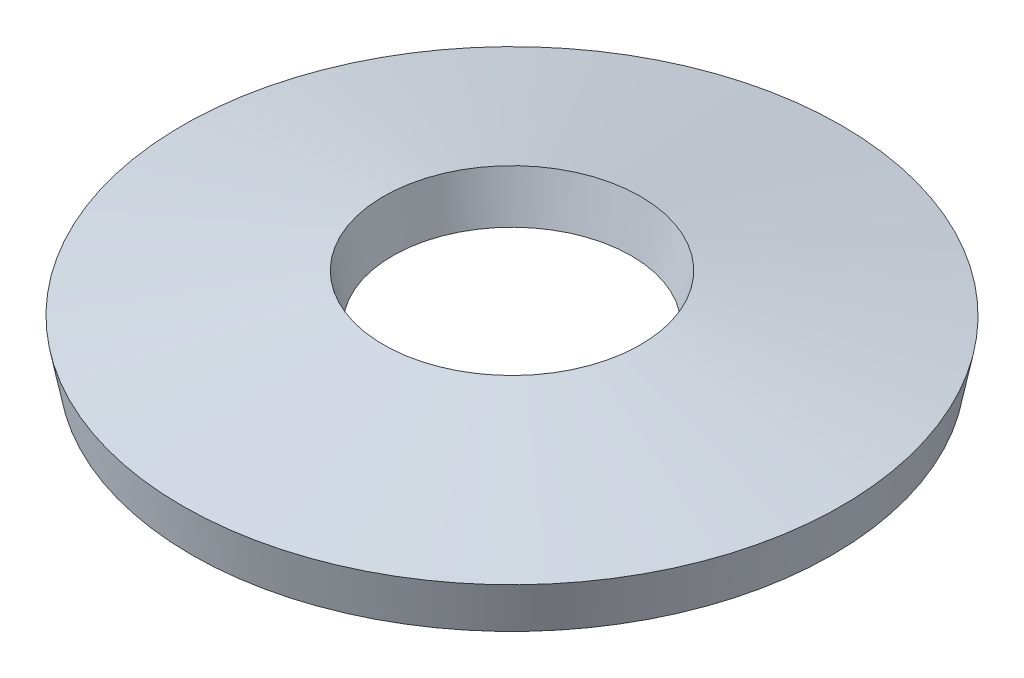
ISO-10303-21;
HEADER;
FILE_DESCRIPTION(('STEP AP214'),'2;1');
FILE_NAME('part.step','',(''),(''),'','','');
FILE_SCHEMA(('AUTOMOTIVE_DESIGN { 1 0 10303 214 1 1 1 1 }'));
ENDSEC;
DATA;
#1=APPLICATION_CONTEXT('core data for automotive mechanical design processes');
#2=APPLICATION_PROTOCOL_DEFINITION('international standard','automotive_design',2000,#1);
#3=PRODUCT_CONTEXT('',#1,'mechanical');
#4=PRODUCT('Part','Part','',(#3));
#5=PRODUCT_RELATED_PRODUCT_CATEGORY('part','',(#4));
#6=PRODUCT_DEFINITION_FORMATION('','',#4);
#7=PRODUCT_DEFINITION_CONTEXT('part definition',#1,'design');
#8=PRODUCT_DEFINITION('design','',#6,#7);
#9=PRODUCT_DEFINITION_SHAPE('','',#8);
#10=(LENGTH_UNIT() NAMED_UNIT(*) SI_UNIT(.MILLI.,.METRE.));
#11=(NAMED_UNIT(*) PLANE_ANGLE_UNIT() SI_UNIT($,.RADIAN.));
#12=(NAMED_UNIT(*) SI_UNIT($,.STERADIAN.) SOLID_ANGLE_UNIT());
#13=UNCERTAINTY_MEASURE_WITH_UNIT(LENGTH_MEASURE(1.E-05),#10,'distance_accuracy_value','');
#14=(GEOMETRIC_REPRESENTATION_CONTEXT(3) GLOBAL_UNCERTAINTY_ASSIGNED_CONTEXT((#13)) GLOBAL_UNIT_ASSIGNED_CONTEXT((#10,
#11,#12)) REPRESENTATION_CONTEXT('',''));
#15=CARTESIAN_POINT('',(0.,0.,0.));
#16=DIRECTION('',(0.,0.,1.));
#17=DIRECTION('',(1.,0.,0.));
#18=AXIS2_PLACEMENT_3D('',#15,#16,#17);
#19=CARTESIAN_POINT('',(0.,0.,0.));
#20=DIRECTION('',(0.,1.,0.));
#21=DIRECTION('',(0.,0.,1.));
#22=AXIS2_PLACEMENT_3D('',#19,#20,#21);
#23=CONICAL_SURFACE('',#22,8.52061348293296,0.192033618696298);
#24=CARTESIAN_POINT('',(0.,1.24665503502136,0.));
#25=DIRECTION('',(0.,-1.,0.));
#26=DIRECTION('',(0.,0.,-1.));
#27=AXIS2_PLACEMENT_3D('',#24,#25,#26);
#28=CIRCLE('',#27,8.763);
#29=CARTESIAN_POINT('',(0.,1.24665503502136,-8.763));
#30=VERTEX_POINT('',#29);
#31=EDGE_CURVE('E44',#30,#30,#28,.T.);
#32=ORIENTED_EDGE('',*,*,#31,.T.);
#33=EDGE_LOOP('',(#32));
#34=FACE_BOUND('',#33,.T.);
#35=CARTESIAN_POINT('',(0.,0.,0.));
#36=DIRECTION('',(0.,-1.,0.));
#37=DIRECTION('',(0.,0.,-1.));
#38=AXIS2_PLACEMENT_3D('',#35,#36,#37);
#39=CIRCLE('',#38,8.52061348293296);
#40=CARTESIAN_POINT('',(0.,0.,-8.52061348293296));
#41=VERTEX_POINT('',#40);
#42=EDGE_CURVE('E10',#41,#41,#39,.T.);
#43=ORIENTED_EDGE('',*,*,#42,.F.);
#44=EDGE_LOOP('',(#43));
#45=FACE_BOUND('',#44,.T.);
#46=ADVANCED_FACE('F30',(#34,#45),#23,.T.);
#47=CARTESIAN_POINT('',(0.,1.03934496497864,0.));
#48=DIRECTION('',(0.,-1.,0.));
#49=DIRECTION('',(0.,0.,-1.));
#50=AXIS2_PLACEMENT_3D('',#47,#48,#49);
#51=CONICAL_SURFACE('',#50,3.175,1.3787627080986);
#52=ORIENTED_EDGE('',*,*,#42,.T.);
#53=EDGE_LOOP('',(#52));
#54=FACE_BOUND('',#53,.T.);
#55=CARTESIAN_POINT('',(0.,1.03934496497864,0.));
#56=DIRECTION('',(0.,-1.,0.));
#57=DIRECTION('',(0.,0.,-1.));
#58=AXIS2_PLACEMENT_3D('',#55,#56,#57);
#59=CIRCLE('',#58,3.175);
#60=CARTESIAN_POINT('',(0.,1.03934496497864,-3.175));
#61=VERTEX_POINT('',#60);
#62=EDGE_CURVE('E36',#61,#61,#59,.T.);
#63=ORIENTED_EDGE('',*,*,#62,.F.);
#64=EDGE_LOOP('',(#63));
#65=FACE_BOUND('',#64,.T.);
#66=ADVANCED_FACE('F60',(#54,#65),#51,.F.);
#67=CARTESIAN_POINT('',(0.,2.286,0.));
#68=DIRECTION('',(0.,1.,0.));
#69=DIRECTION('',(0.,0.,1.));
#70=AXIS2_PLACEMENT_3D('',#67,#68,#69);
#71=CONICAL_SURFACE('',#70,3.41738651706704,0.192033618696299);
#72=ORIENTED_EDGE('',*,*,#62,.T.);
#73=EDGE_LOOP('',(#72));
#74=FACE_BOUND('',#73,.T.);
#75=CARTESIAN_POINT('',(0.,2.286,0.));
#76=DIRECTION('',(0.,-1.,0.));
#77=DIRECTION('',(0.,0.,-1.));
#78=AXIS2_PLACEMENT_3D('',#75,#76,#77);
#79=CIRCLE('',#78,3.41738651706704);
#80=CARTESIAN_POINT('',(0.,2.286,-3.41738651706704));
#81=VERTEX_POINT('',#80);
#82=EDGE_CURVE('E40',#81,#81,#79,.T.);
#83=ORIENTED_EDGE('',*,*,#82,.F.);
#84=EDGE_LOOP('',(#83));
#85=FACE_BOUND('',#84,.T.);
#86=ADVANCED_FACE('F54',(#74,#85),#71,.F.);
#87=CARTESIAN_POINT('',(0.,1.24665503502136,0.));
#88=DIRECTION('',(0.,-1.,0.));
#89=DIRECTION('',(0.,0.,-1.));
#90=AXIS2_PLACEMENT_3D('',#87,#88,#89);
#91=CONICAL_SURFACE('',#90,8.763,1.3787627080986);
#92=ORIENTED_EDGE('',*,*,#82,.T.);
#93=EDGE_LOOP('',(#92));
#94=FACE_BOUND('',#93,.T.);
#95=ORIENTED_EDGE('',*,*,#31,.F.);
#96=EDGE_LOOP('',(#95));
#97=FACE_BOUND('',#96,.T.);
#98=ADVANCED_FACE('F52',(#94,#97),#91,.T.);
#99=CLOSED_SHELL('',(#46,#66,#86,#98));
#100=MANIFOLD_SOLID_BREP('B2',#99);
#101=ADVANCED_BREP_SHAPE_REPRESENTATION('',(#18,#100),#14);
#102=SHAPE_DEFINITION_REPRESENTATION(#9,#101);
ENDSEC;
END-ISO-10303-21;
